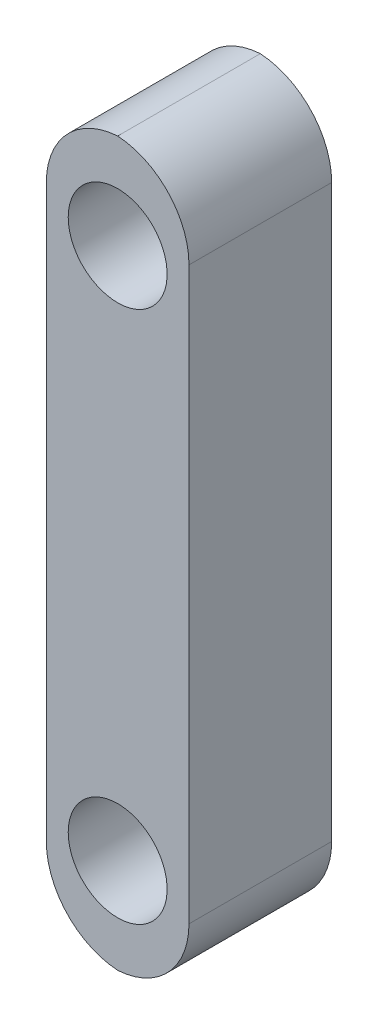
ISO-10303-21;
HEADER;
FILE_DESCRIPTION(('STEP AP214'),'2;1');
FILE_NAME('part.step','',(''),(''),'','','');
FILE_SCHEMA(('AUTOMOTIVE_DESIGN { 1 0 10303 214 1 1 1 1 }'));
ENDSEC;
DATA;
#1=APPLICATION_CONTEXT('core data for automotive mechanical design processes');
#2=APPLICATION_PROTOCOL_DEFINITION('international standard','automotive_design',2000,#1);
#3=PRODUCT_CONTEXT('',#1,'mechanical');
#4=PRODUCT('Part','Part','',(#3));
#5=PRODUCT_RELATED_PRODUCT_CATEGORY('part','',(#4));
#6=PRODUCT_DEFINITION_FORMATION('','',#4);
#7=PRODUCT_DEFINITION_CONTEXT('part definition',#1,'design');
#8=PRODUCT_DEFINITION('design','',#6,#7);
#9=PRODUCT_DEFINITION_SHAPE('','',#8);
#10=(LENGTH_UNIT() NAMED_UNIT(*) SI_UNIT(.MILLI.,.METRE.));
#11=(NAMED_UNIT(*) PLANE_ANGLE_UNIT() SI_UNIT($,.RADIAN.));
#12=(NAMED_UNIT(*) SI_UNIT($,.STERADIAN.) SOLID_ANGLE_UNIT());
#13=UNCERTAINTY_MEASURE_WITH_UNIT(LENGTH_MEASURE(1.E-05),#10,'distance_accuracy_value','');
#14=(GEOMETRIC_REPRESENTATION_CONTEXT(3) GLOBAL_UNCERTAINTY_ASSIGNED_CONTEXT((#13)) GLOBAL_UNIT_ASSIGNED_CONTEXT((#10,
#11,#12)) REPRESENTATION_CONTEXT('',''));
#15=CARTESIAN_POINT('',(0.,0.,0.));
#16=DIRECTION('',(0.,0.,1.));
#17=DIRECTION('',(1.,0.,0.));
#18=AXIS2_PLACEMENT_3D('',#15,#16,#17);
#19=CARTESIAN_POINT('',(0.,0.,9.525));
#20=DIRECTION('',(0.,0.,1.));
#21=DIRECTION('',(1.,0.,0.));
#22=AXIS2_PLACEMENT_3D('',#19,#20,#21);
#23=PLANE('',#22);
#24=CARTESIAN_POINT('',(0.,-17.78,9.525));
#25=DIRECTION('',(0.,0.,1.));
#26=DIRECTION('',(1.,0.,0.));
#27=AXIS2_PLACEMENT_3D('',#24,#25,#26);
#28=CIRCLE('',#27,3.302);
#29=CARTESIAN_POINT('',(-3.302,-17.78,9.525));
#30=VERTEX_POINT('',#29);
#31=EDGE_CURVE('E111',#30,#30,#28,.T.);
#32=ORIENTED_EDGE('',*,*,#31,.F.);
#33=EDGE_LOOP('',(#32));
#34=FACE_BOUND('',#33,.T.);
#35=DIRECTION('',(0.,-1.,0.));
#36=VECTOR('',#35,1.);
#37=CARTESIAN_POINT('',(-4.7625,24.13,9.525));
#38=LINE('',#37,#36);
#39=CARTESIAN_POINT('',(-4.7625,19.05,9.525));
#40=VERTEX_POINT('',#39);
#41=CARTESIAN_POINT('',(-4.7625,-19.05,9.525));
#42=VERTEX_POINT('',#41);
#43=EDGE_CURVE('E162',#40,#42,#38,.T.);
#44=ORIENTED_EDGE('',*,*,#43,.T.);
#45=CARTESIAN_POINT('',(0.317500000000003,-19.05,9.525));
#46=DIRECTION('',(0.,0.,1.));
#47=DIRECTION('',(1.,0.,0.));
#48=AXIS2_PLACEMENT_3D('',#45,#46,#47);
#49=CIRCLE('',#48,5.08);
#50=CARTESIAN_POINT('',(0.,-24.1200684166981,9.525));
#51=VERTEX_POINT('',#50);
#52=EDGE_CURVE('E57',#42,#51,#49,.T.);
#53=ORIENTED_EDGE('',*,*,#52,.T.);
#54=CARTESIAN_POINT('',(-0.317499999999997,-19.05,9.525));
#55=DIRECTION('',(0.,0.,1.));
#56=DIRECTION('',(1.,0.,0.));
#57=AXIS2_PLACEMENT_3D('',#54,#55,#56);
#58=CIRCLE('',#57,5.08);
#59=CARTESIAN_POINT('',(4.7625,-19.05,9.525));
#60=VERTEX_POINT('',#59);
#61=EDGE_CURVE('E139',#51,#60,#58,.T.);
#62=ORIENTED_EDGE('',*,*,#61,.T.);
#63=DIRECTION('',(0.,1.,0.));
#64=VECTOR('',#63,1.);
#65=CARTESIAN_POINT('',(4.7625,24.13,9.525));
#66=LINE('',#65,#64);
#67=CARTESIAN_POINT('',(4.7625,19.05,9.525));
#68=VERTEX_POINT('',#67);
#69=EDGE_CURVE('E99',#60,#68,#66,.T.);
#70=ORIENTED_EDGE('',*,*,#69,.T.);
#71=CARTESIAN_POINT('',(-0.317500000000001,19.05,9.525));
#72=DIRECTION('',(0.,0.,1.));
#73=DIRECTION('',(1.,0.,0.));
#74=AXIS2_PLACEMENT_3D('',#71,#72,#73);
#75=CIRCLE('',#74,5.08);
#76=CARTESIAN_POINT('',(0.,24.1200684166981,9.525));
#77=VERTEX_POINT('',#76);
#78=EDGE_CURVE('E64',#68,#77,#75,.T.);
#79=ORIENTED_EDGE('',*,*,#78,.T.);
#80=CARTESIAN_POINT('',(0.317499999999999,19.05,9.525));
#81=DIRECTION('',(0.,0.,1.));
#82=DIRECTION('',(1.,0.,0.));
#83=AXIS2_PLACEMENT_3D('',#80,#81,#82);
#84=CIRCLE('',#83,5.08);
#85=EDGE_CURVE('E134',#77,#40,#84,.T.);
#86=ORIENTED_EDGE('',*,*,#85,.T.);
#87=EDGE_LOOP('',(#44,#53,#62,#70,#79,#86));
#88=FACE_BOUND('',#87,.T.);
#89=CARTESIAN_POINT('',(0.,17.78,9.525));
#90=DIRECTION('',(0.,0.,1.));
#91=DIRECTION('',(1.,0.,0.));
#92=AXIS2_PLACEMENT_3D('',#89,#90,#91);
#93=CIRCLE('',#92,3.302);
#94=CARTESIAN_POINT('',(-3.302,17.78,9.525));
#95=VERTEX_POINT('',#94);
#96=EDGE_CURVE('E151',#95,#95,#93,.T.);
#97=ORIENTED_EDGE('',*,*,#96,.F.);
#98=EDGE_LOOP('',(#97));
#99=FACE_BOUND('',#98,.T.);
#100=ADVANCED_FACE('F39',(#34,#88,#99),#23,.T.);
#101=CARTESIAN_POINT('',(0.,0.,0.));
#102=DIRECTION('',(0.,0.,1.));
#103=DIRECTION('',(1.,0.,0.));
#104=AXIS2_PLACEMENT_3D('',#101,#102,#103);
#105=PLANE('',#104);
#106=CARTESIAN_POINT('',(-0.317499999999997,-19.05,0.));
#107=DIRECTION('',(0.,0.,1.));
#108=DIRECTION('',(1.,0.,0.));
#109=AXIS2_PLACEMENT_3D('',#106,#107,#108);
#110=CIRCLE('',#109,5.08);
#111=CARTESIAN_POINT('',(4.7625,-19.05,0.));
#112=VERTEX_POINT('',#111);
#113=CARTESIAN_POINT('',(0.,-24.1200684166981,0.));
#114=VERTEX_POINT('',#113);
#115=EDGE_CURVE('E105',#112,#114,#110,.F.);
#116=ORIENTED_EDGE('',*,*,#115,.T.);
#117=CARTESIAN_POINT('',(0.317500000000003,-19.05,0.));
#118=DIRECTION('',(0.,0.,1.));
#119=DIRECTION('',(1.,0.,0.));
#120=AXIS2_PLACEMENT_3D('',#117,#118,#119);
#121=CIRCLE('',#120,5.08);
#122=CARTESIAN_POINT('',(-4.7625,-19.05,0.));
#123=VERTEX_POINT('',#122);
#124=EDGE_CURVE('E118',#114,#123,#121,.F.);
#125=ORIENTED_EDGE('',*,*,#124,.T.);
#126=DIRECTION('',(0.,-1.,0.));
#127=VECTOR('',#126,1.);
#128=CARTESIAN_POINT('',(-4.7625,24.13,0.));
#129=LINE('',#128,#127);
#130=CARTESIAN_POINT('',(-4.7625,19.05,0.));
#131=VERTEX_POINT('',#130);
#132=EDGE_CURVE('E110',#131,#123,#129,.T.);
#133=ORIENTED_EDGE('',*,*,#132,.F.);
#134=CARTESIAN_POINT('',(0.317499999999999,19.05,0.));
#135=DIRECTION('',(0.,0.,1.));
#136=DIRECTION('',(1.,0.,0.));
#137=AXIS2_PLACEMENT_3D('',#134,#135,#136);
#138=CIRCLE('',#137,5.08);
#139=CARTESIAN_POINT('',(0.,24.1200684166981,0.));
#140=VERTEX_POINT('',#139);
#141=EDGE_CURVE('E124',#131,#140,#138,.F.);
#142=ORIENTED_EDGE('',*,*,#141,.T.);
#143=CARTESIAN_POINT('',(-0.317500000000001,19.05,0.));
#144=DIRECTION('',(0.,0.,1.));
#145=DIRECTION('',(1.,0.,0.));
#146=AXIS2_PLACEMENT_3D('',#143,#144,#145);
#147=CIRCLE('',#146,5.08);
#148=CARTESIAN_POINT('',(4.7625,19.05,0.));
#149=VERTEX_POINT('',#148);
#150=EDGE_CURVE('E108',#140,#149,#147,.F.);
#151=ORIENTED_EDGE('',*,*,#150,.T.);
#152=DIRECTION('',(0.,1.,0.));
#153=VECTOR('',#152,1.);
#154=CARTESIAN_POINT('',(4.7625,24.13,0.));
#155=LINE('',#154,#153);
#156=EDGE_CURVE('E97',#112,#149,#155,.T.);
#157=ORIENTED_EDGE('',*,*,#156,.F.);
#158=EDGE_LOOP('',(#116,#125,#133,#142,#151,#157));
#159=FACE_BOUND('',#158,.T.);
#160=CARTESIAN_POINT('',(0.,-17.78,0.));
#161=DIRECTION('',(0.,0.,1.));
#162=DIRECTION('',(1.,0.,0.));
#163=AXIS2_PLACEMENT_3D('',#160,#161,#162);
#164=CIRCLE('',#163,3.302);
#165=CARTESIAN_POINT('',(-3.302,-17.78,0.));
#166=VERTEX_POINT('',#165);
#167=EDGE_CURVE('E267',#166,#166,#164,.T.);
#168=ORIENTED_EDGE('',*,*,#167,.T.);
#169=EDGE_LOOP('',(#168));
#170=FACE_BOUND('',#169,.T.);
#171=CARTESIAN_POINT('',(0.,17.78,0.));
#172=DIRECTION('',(0.,0.,1.));
#173=DIRECTION('',(1.,0.,0.));
#174=AXIS2_PLACEMENT_3D('',#171,#172,#173);
#175=CIRCLE('',#174,3.302);
#176=CARTESIAN_POINT('',(-3.302,17.78,0.));
#177=VERTEX_POINT('',#176);
#178=EDGE_CURVE('E146',#177,#177,#175,.T.);
#179=ORIENTED_EDGE('',*,*,#178,.T.);
#180=EDGE_LOOP('',(#179));
#181=FACE_BOUND('',#180,.T.);
#182=ADVANCED_FACE('F103',(#159,#170,#181),#105,.F.);
#183=CARTESIAN_POINT('',(4.7625,24.13,9.525));
#184=DIRECTION('',(-1.,0.,0.));
#185=DIRECTION('',(0.,-1.,0.));
#186=AXIS2_PLACEMENT_3D('',#183,#184,#185);
#187=PLANE('',#186);
#188=ORIENTED_EDGE('',*,*,#69,.F.);
#189=DIRECTION('',(0.,0.,-1.));
#190=VECTOR('',#189,1.);
#191=CARTESIAN_POINT('',(4.7625,-19.05,9.525));
#192=LINE('',#191,#190);
#193=EDGE_CURVE('E11',#60,#112,#192,.T.);
#194=ORIENTED_EDGE('',*,*,#193,.T.);
#195=ORIENTED_EDGE('',*,*,#156,.T.);
#196=DIRECTION('',(0.,0.,-1.));
#197=VECTOR('',#196,1.);
#198=CARTESIAN_POINT('',(4.7625,19.05,9.525));
#199=LINE('',#198,#197);
#200=EDGE_CURVE('E49',#149,#68,#199,.F.);
#201=ORIENTED_EDGE('',*,*,#200,.T.);
#202=EDGE_LOOP('',(#188,#194,#195,#201));
#203=FACE_BOUND('',#202,.T.);
#204=ADVANCED_FACE('F95',(#203),#187,.F.);
#205=CARTESIAN_POINT('',(-4.7625,24.13,9.525));
#206=DIRECTION('',(1.,0.,0.));
#207=DIRECTION('',(0.,1.,0.));
#208=AXIS2_PLACEMENT_3D('',#205,#206,#207);
#209=PLANE('',#208);
#210=ORIENTED_EDGE('',*,*,#132,.T.);
#211=DIRECTION('',(0.,0.,-1.));
#212=VECTOR('',#211,1.);
#213=CARTESIAN_POINT('',(-4.7625,-19.05,9.525));
#214=LINE('',#213,#212);
#215=EDGE_CURVE('E130',#123,#42,#214,.F.);
#216=ORIENTED_EDGE('',*,*,#215,.T.);
#217=ORIENTED_EDGE('',*,*,#43,.F.);
#218=DIRECTION('',(0.,0.,-1.));
#219=VECTOR('',#218,1.);
#220=CARTESIAN_POINT('',(-4.7625,19.05,9.525));
#221=LINE('',#220,#219);
#222=EDGE_CURVE('E122',#40,#131,#221,.T.);
#223=ORIENTED_EDGE('',*,*,#222,.T.);
#224=EDGE_LOOP('',(#210,#216,#217,#223));
#225=FACE_BOUND('',#224,.T.);
#226=ADVANCED_FACE('F165',(#225),#209,.F.);
#227=CARTESIAN_POINT('',(0.,-17.78,9.525));
#228=DIRECTION('',(0.,0.,-1.));
#229=DIRECTION('',(-1.,0.,0.));
#230=AXIS2_PLACEMENT_3D('',#227,#228,#229);
#231=CYLINDRICAL_SURFACE('',#230,3.302);
#232=CARTESIAN_POINT('',(-3.302,-17.78,9.525));
#233=CARTESIAN_POINT('',(-3.302,-17.78,9.42578125));
#234=CARTESIAN_POINT('',(-3.302,-17.78,9.3265625));
#235=CARTESIAN_POINT('',(-3.302,-17.78,9.128125));
#236=CARTESIAN_POINT('',(-3.302,-17.78,9.02890625));
#237=CARTESIAN_POINT('',(-3.302,-17.78,8.83046875));
#238=CARTESIAN_POINT('',(-3.302,-17.78,8.73125));
#239=CARTESIAN_POINT('',(-3.302,-17.78,8.5328125));
#240=CARTESIAN_POINT('',(-3.302,-17.78,8.43359375));
#241=CARTESIAN_POINT('',(-3.302,-17.78,8.23515625));
#242=CARTESIAN_POINT('',(-3.302,-17.78,8.1359375));
#243=CARTESIAN_POINT('',(-3.302,-17.78,7.9375));
#244=CARTESIAN_POINT('',(-3.302,-17.78,7.83828125));
#245=CARTESIAN_POINT('',(-3.302,-17.78,7.63984375));
#246=CARTESIAN_POINT('',(-3.302,-17.78,7.540625));
#247=CARTESIAN_POINT('',(-3.302,-17.78,7.3421875));
#248=CARTESIAN_POINT('',(-3.302,-17.78,7.24296875));
#249=CARTESIAN_POINT('',(-3.302,-17.78,7.04453125));
#250=CARTESIAN_POINT('',(-3.302,-17.78,6.9453125));
#251=CARTESIAN_POINT('',(-3.302,-17.78,6.746875));
#252=CARTESIAN_POINT('',(-3.302,-17.78,6.64765625));
#253=CARTESIAN_POINT('',(-3.302,-17.78,6.44921875));
#254=CARTESIAN_POINT('',(-3.302,-17.78,6.35));
#255=CARTESIAN_POINT('',(-3.302,-17.78,6.1515625));
#256=CARTESIAN_POINT('',(-3.302,-17.78,6.05234375));
#257=CARTESIAN_POINT('',(-3.302,-17.78,5.85390625));
#258=CARTESIAN_POINT('',(-3.302,-17.78,5.7546875));
#259=CARTESIAN_POINT('',(-3.302,-17.78,5.55625));
#260=CARTESIAN_POINT('',(-3.302,-17.78,5.45703125));
#261=CARTESIAN_POINT('',(-3.302,-17.78,5.25859375));
#262=CARTESIAN_POINT('',(-3.302,-17.78,5.159375));
#263=CARTESIAN_POINT('',(-3.302,-17.78,4.9609375));
#264=CARTESIAN_POINT('',(-3.302,-17.78,4.86171875));
#265=CARTESIAN_POINT('',(-3.302,-17.78,4.66328125));
#266=CARTESIAN_POINT('',(-3.302,-17.78,4.5640625));
#267=CARTESIAN_POINT('',(-3.302,-17.78,4.365625));
#268=CARTESIAN_POINT('',(-3.302,-17.78,4.26640625));
#269=CARTESIAN_POINT('',(-3.302,-17.78,4.06796875));
#270=CARTESIAN_POINT('',(-3.302,-17.78,3.96875));
#271=CARTESIAN_POINT('',(-3.302,-17.78,3.7703125));
#272=CARTESIAN_POINT('',(-3.302,-17.78,3.67109375));
#273=CARTESIAN_POINT('',(-3.302,-17.78,3.47265625));
#274=CARTESIAN_POINT('',(-3.302,-17.78,3.3734375));
#275=CARTESIAN_POINT('',(-3.302,-17.78,3.175));
#276=CARTESIAN_POINT('',(-3.302,-17.78,3.07578125));
#277=CARTESIAN_POINT('',(-3.302,-17.78,2.87734375));
#278=CARTESIAN_POINT('',(-3.302,-17.78,2.778125));
#279=CARTESIAN_POINT('',(-3.302,-17.78,2.5796875));
#280=CARTESIAN_POINT('',(-3.302,-17.78,2.48046875));
#281=CARTESIAN_POINT('',(-3.302,-17.78,2.28203125));
#282=CARTESIAN_POINT('',(-3.302,-17.78,2.1828125));
#283=CARTESIAN_POINT('',(-3.302,-17.78,1.984375));
#284=CARTESIAN_POINT('',(-3.302,-17.78,1.88515625));
#285=CARTESIAN_POINT('',(-3.302,-17.78,1.68671875));
#286=CARTESIAN_POINT('',(-3.302,-17.78,1.5875));
#287=CARTESIAN_POINT('',(-3.302,-17.78,1.3890625));
#288=CARTESIAN_POINT('',(-3.302,-17.78,1.28984375));
#289=CARTESIAN_POINT('',(-3.302,-17.78,1.09140625));
#290=CARTESIAN_POINT('',(-3.302,-17.78,0.992187500000001));
#291=CARTESIAN_POINT('',(-3.302,-17.78,0.793750000000001));
#292=CARTESIAN_POINT('',(-3.302,-17.78,0.69453125));
#293=CARTESIAN_POINT('',(-3.302,-17.78,0.49609375));
#294=CARTESIAN_POINT('',(-3.302,-17.78,0.396875));
#295=CARTESIAN_POINT('',(-3.302,-17.78,0.1984375));
#296=CARTESIAN_POINT('',(-3.302,-17.78,0.0992187500000001));
#297=CARTESIAN_POINT('',(-3.302,-17.78,0.));
#298=B_SPLINE_CURVE_WITH_KNOTS('',3,(#232,#233,#234,#235,#236,#237,#238,#239,#240,#241,#242,
#243,#244,#245,#246,#247,#248,#249,#250,#251,#252,#253,#254,#255,#256,#257,#258,#259,#260,#261,
#262,#263,#264,#265,#266,#267,#268,#269,#270,#271,#272,#273,#274,#275,#276,#277,#278,#279,#280,
#281,#282,#283,#284,#285,#286,#287,#288,#289,#290,#291,#292,#293,#294,#295,#296,#297),
.UNSPECIFIED.,.F.,.F.,(4,2,2,2,2,2,2,2,2,2,2,2,2,2,2,2,2,2,2,2,2,2,2,2,2,2,2,2,2,2,2,2,4),(0.,
0.297656249999998,0.595312499999999,0.892968749999999,1.190625,1.48828125,1.7859375,2.08359375,
2.38125,2.67890625,2.9765625,3.27421875,3.571875,3.86953125,4.1671875,4.46484375,4.7625,
5.06015625,5.3578125,5.65546875,5.953125,6.25078125,6.5484375,6.84609375,7.14375,7.44140625,
7.7390625,8.03671875,8.334375,8.63203125,8.9296875,9.22734375,9.525),.UNSPECIFIED.);
#299=EDGE_CURVE('BSEAM195',#30,#166,#298,.T.);
#300=ORIENTED_EDGE('',*,*,#31,.T.);
#301=ORIENTED_EDGE('',*,*,#167,.F.);
#302=ORIENTED_EDGE('',*,*,#299,.T.);
#303=ORIENTED_EDGE('',*,*,#299,.F.);
#304=EDGE_LOOP('',(#300,#302,#301,#303));
#305=FACE_BOUND('',#304,.T.);
#306=ADVANCED_FACE('F195',(#305),#231,.F.);
#307=CARTESIAN_POINT('',(0.,17.78,9.525));
#308=DIRECTION('',(0.,0.,-1.));
#309=DIRECTION('',(-1.,0.,0.));
#310=AXIS2_PLACEMENT_3D('',#307,#308,#309);
#311=CYLINDRICAL_SURFACE('',#310,3.302);
#312=CARTESIAN_POINT('',(-3.302,17.78,9.525));
#313=CARTESIAN_POINT('',(-3.302,17.78,9.42578125));
#314=CARTESIAN_POINT('',(-3.302,17.78,9.3265625));
#315=CARTESIAN_POINT('',(-3.302,17.78,9.128125));
#316=CARTESIAN_POINT('',(-3.302,17.78,9.02890625));
#317=CARTESIAN_POINT('',(-3.302,17.78,8.83046875));
#318=CARTESIAN_POINT('',(-3.302,17.78,8.73125));
#319=CARTESIAN_POINT('',(-3.302,17.78,8.5328125));
#320=CARTESIAN_POINT('',(-3.302,17.78,8.43359375));
#321=CARTESIAN_POINT('',(-3.302,17.78,8.23515625));
#322=CARTESIAN_POINT('',(-3.302,17.78,8.1359375));
#323=CARTESIAN_POINT('',(-3.302,17.78,7.9375));
#324=CARTESIAN_POINT('',(-3.302,17.78,7.83828125));
#325=CARTESIAN_POINT('',(-3.302,17.78,7.63984375));
#326=CARTESIAN_POINT('',(-3.302,17.78,7.540625));
#327=CARTESIAN_POINT('',(-3.302,17.78,7.3421875));
#328=CARTESIAN_POINT('',(-3.302,17.78,7.24296875));
#329=CARTESIAN_POINT('',(-3.302,17.78,7.04453125));
#330=CARTESIAN_POINT('',(-3.302,17.78,6.9453125));
#331=CARTESIAN_POINT('',(-3.302,17.78,6.746875));
#332=CARTESIAN_POINT('',(-3.302,17.78,6.64765625));
#333=CARTESIAN_POINT('',(-3.302,17.78,6.44921875));
#334=CARTESIAN_POINT('',(-3.302,17.78,6.35));
#335=CARTESIAN_POINT('',(-3.302,17.78,6.1515625));
#336=CARTESIAN_POINT('',(-3.302,17.78,6.05234375));
#337=CARTESIAN_POINT('',(-3.302,17.78,5.85390625));
#338=CARTESIAN_POINT('',(-3.302,17.78,5.7546875));
#339=CARTESIAN_POINT('',(-3.302,17.78,5.55625));
#340=CARTESIAN_POINT('',(-3.302,17.78,5.45703125));
#341=CARTESIAN_POINT('',(-3.302,17.78,5.25859375));
#342=CARTESIAN_POINT('',(-3.302,17.78,5.159375));
#343=CARTESIAN_POINT('',(-3.302,17.78,4.9609375));
#344=CARTESIAN_POINT('',(-3.302,17.78,4.86171875));
#345=CARTESIAN_POINT('',(-3.302,17.78,4.66328125));
#346=CARTESIAN_POINT('',(-3.302,17.78,4.5640625));
#347=CARTESIAN_POINT('',(-3.302,17.78,4.365625));
#348=CARTESIAN_POINT('',(-3.302,17.78,4.26640625));
#349=CARTESIAN_POINT('',(-3.302,17.78,4.06796875));
#350=CARTESIAN_POINT('',(-3.302,17.78,3.96875));
#351=CARTESIAN_POINT('',(-3.302,17.78,3.7703125));
#352=CARTESIAN_POINT('',(-3.302,17.78,3.67109375));
#353=CARTESIAN_POINT('',(-3.302,17.78,3.47265625));
#354=CARTESIAN_POINT('',(-3.302,17.78,3.3734375));
#355=CARTESIAN_POINT('',(-3.302,17.78,3.175));
#356=CARTESIAN_POINT('',(-3.302,17.78,3.07578125));
#357=CARTESIAN_POINT('',(-3.302,17.78,2.87734375));
#358=CARTESIAN_POINT('',(-3.302,17.78,2.778125));
#359=CARTESIAN_POINT('',(-3.302,17.78,2.5796875));
#360=CARTESIAN_POINT('',(-3.302,17.78,2.48046875));
#361=CARTESIAN_POINT('',(-3.302,17.78,2.28203125));
#362=CARTESIAN_POINT('',(-3.302,17.78,2.1828125));
#363=CARTESIAN_POINT('',(-3.302,17.78,1.984375));
#364=CARTESIAN_POINT('',(-3.302,17.78,1.88515625));
#365=CARTESIAN_POINT('',(-3.302,17.78,1.68671875));
#366=CARTESIAN_POINT('',(-3.302,17.78,1.5875));
#367=CARTESIAN_POINT('',(-3.302,17.78,1.3890625));
#368=CARTESIAN_POINT('',(-3.302,17.78,1.28984375));
#369=CARTESIAN_POINT('',(-3.302,17.78,1.09140625));
#370=CARTESIAN_POINT('',(-3.302,17.78,0.992187500000001));
#371=CARTESIAN_POINT('',(-3.302,17.78,0.793750000000001));
#372=CARTESIAN_POINT('',(-3.302,17.78,0.69453125));
#373=CARTESIAN_POINT('',(-3.302,17.78,0.49609375));
#374=CARTESIAN_POINT('',(-3.302,17.78,0.396875));
#375=CARTESIAN_POINT('',(-3.302,17.78,0.1984375));
#376=CARTESIAN_POINT('',(-3.302,17.78,0.0992187500000001));
#377=CARTESIAN_POINT('',(-3.302,17.78,0.));
#378=B_SPLINE_CURVE_WITH_KNOTS('',3,(#312,#313,#314,#315,#316,#317,#318,#319,#320,#321,#322,
#323,#324,#325,#326,#327,#328,#329,#330,#331,#332,#333,#334,#335,#336,#337,#338,#339,#340,#341,
#342,#343,#344,#345,#346,#347,#348,#349,#350,#351,#352,#353,#354,#355,#356,#357,#358,#359,#360,
#361,#362,#363,#364,#365,#366,#367,#368,#369,#370,#371,#372,#373,#374,#375,#376,#377),
.UNSPECIFIED.,.F.,.F.,(4,2,2,2,2,2,2,2,2,2,2,2,2,2,2,2,2,2,2,2,2,2,2,2,2,2,2,2,2,2,2,2,4),(0.,
0.297656249999998,0.595312499999999,0.892968749999999,1.190625,1.48828125,1.7859375,2.08359375,
2.38125,2.67890625,2.9765625,3.27421875,3.571875,3.86953125,4.1671875,4.46484375,4.7625,
5.06015625,5.3578125,5.65546875,5.953125,6.25078125,6.5484375,6.84609375,7.14375,7.44140625,
7.7390625,8.03671875,8.334375,8.63203125,8.9296875,9.22734375,9.525),.UNSPECIFIED.);
#379=EDGE_CURVE('BSEAM183',#95,#177,#378,.T.);
#380=ORIENTED_EDGE('',*,*,#96,.T.);
#381=ORIENTED_EDGE('',*,*,#178,.F.);
#382=ORIENTED_EDGE('',*,*,#379,.T.);
#383=ORIENTED_EDGE('',*,*,#379,.F.);
#384=EDGE_LOOP('',(#380,#382,#381,#383));
#385=FACE_BOUND('',#384,.T.);
#386=ADVANCED_FACE('F183',(#385),#311,.F.);
#387=CARTESIAN_POINT('',(-0.317499999999997,-19.05,9.525));
#388=DIRECTION('',(0.,0.,-1.));
#389=DIRECTION('',(-1.,0.,0.));
#390=AXIS2_PLACEMENT_3D('',#387,#388,#389);
#391=CYLINDRICAL_SURFACE('',#390,5.08);
#392=ORIENTED_EDGE('',*,*,#193,.F.);
#393=ORIENTED_EDGE('',*,*,#61,.F.);
#394=DIRECTION('',(0.,0.,-1.));
#395=VECTOR('',#394,1.);
#396=CARTESIAN_POINT('',(0.,-24.1200684166981,4.7625));
#397=LINE('',#396,#395);
#398=EDGE_CURVE('E115',#114,#51,#397,.F.);
#399=ORIENTED_EDGE('',*,*,#398,.F.);
#400=ORIENTED_EDGE('',*,*,#115,.F.);
#401=EDGE_LOOP('',(#392,#393,#399,#400));
#402=FACE_BOUND('',#401,.T.);
#403=ADVANCED_FACE('F113',(#402),#391,.T.);
#404=CARTESIAN_POINT('',(0.317500000000003,-19.05,9.525));
#405=DIRECTION('',(0.,0.,-1.));
#406=DIRECTION('',(-1.,0.,0.));
#407=AXIS2_PLACEMENT_3D('',#404,#405,#406);
#408=CYLINDRICAL_SURFACE('',#407,5.08);
#409=ORIENTED_EDGE('',*,*,#52,.F.);
#410=ORIENTED_EDGE('',*,*,#215,.F.);
#411=ORIENTED_EDGE('',*,*,#124,.F.);
#412=ORIENTED_EDGE('',*,*,#398,.T.);
#413=EDGE_LOOP('',(#409,#410,#411,#412));
#414=FACE_BOUND('',#413,.T.);
#415=ADVANCED_FACE('F176',(#414),#408,.T.);
#416=CARTESIAN_POINT('',(0.317499999999999,19.05,9.525));
#417=DIRECTION('',(0.,0.,-1.));
#418=DIRECTION('',(-1.,0.,0.));
#419=AXIS2_PLACEMENT_3D('',#416,#417,#418);
#420=CYLINDRICAL_SURFACE('',#419,5.08);
#421=ORIENTED_EDGE('',*,*,#222,.F.);
#422=ORIENTED_EDGE('',*,*,#85,.F.);
#423=DIRECTION('',(0.,0.,-1.));
#424=VECTOR('',#423,1.);
#425=CARTESIAN_POINT('',(0.,24.1200684166981,4.7625));
#426=LINE('',#425,#424);
#427=EDGE_CURVE('E43',#140,#77,#426,.F.);
#428=ORIENTED_EDGE('',*,*,#427,.F.);
#429=ORIENTED_EDGE('',*,*,#141,.F.);
#430=EDGE_LOOP('',(#421,#422,#428,#429));
#431=FACE_BOUND('',#430,.T.);
#432=ADVANCED_FACE('F41',(#431),#420,.T.);
#433=CARTESIAN_POINT('',(-0.317500000000001,19.05,9.525));
#434=DIRECTION('',(0.,0.,-1.));
#435=DIRECTION('',(-1.,0.,0.));
#436=AXIS2_PLACEMENT_3D('',#433,#434,#435);
#437=CYLINDRICAL_SURFACE('',#436,5.08);
#438=ORIENTED_EDGE('',*,*,#78,.F.);
#439=ORIENTED_EDGE('',*,*,#200,.F.);
#440=ORIENTED_EDGE('',*,*,#150,.F.);
#441=ORIENTED_EDGE('',*,*,#427,.T.);
#442=EDGE_LOOP('',(#438,#439,#440,#441));
#443=FACE_BOUND('',#442,.T.);
#444=ADVANCED_FACE('F156',(#443),#437,.T.);
#445=CLOSED_SHELL('',(#100,#182,#204,#226,#306,#386,#403,#415,#432,#444));
#446=MANIFOLD_SOLID_BREP('B2',#445);
#447=ADVANCED_BREP_SHAPE_REPRESENTATION('',(#18,#446),#14);
#448=SHAPE_DEFINITION_REPRESENTATION(#9,#447);
ENDSEC;
END-ISO-10303-21;
